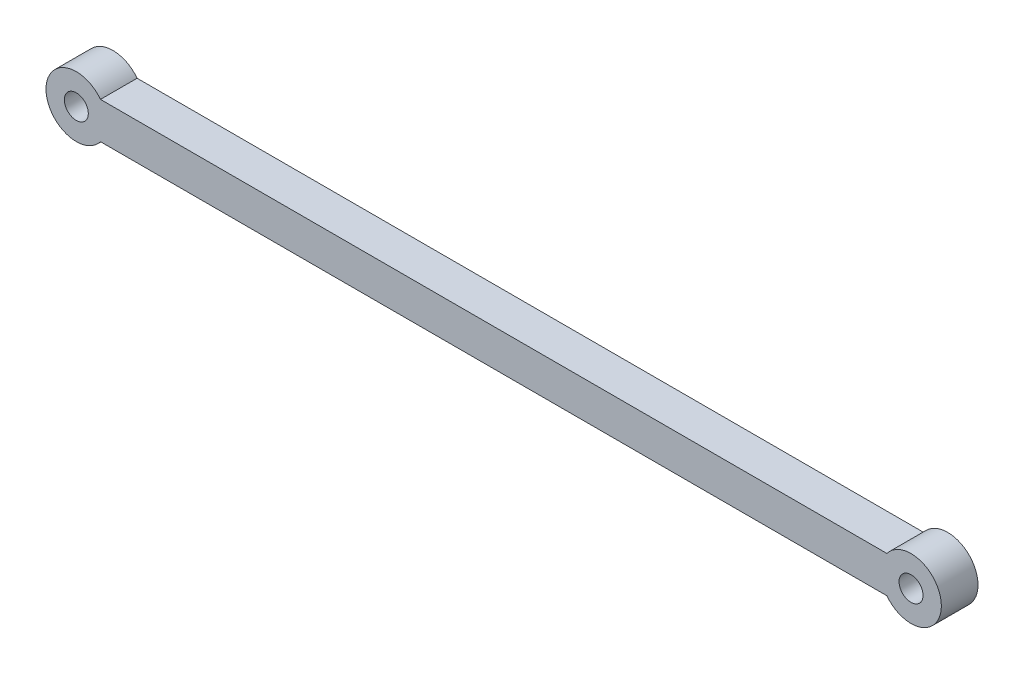
ISO-10303-21;
HEADER;
FILE_DESCRIPTION(('STEP AP214'),'2;1');
FILE_NAME('part.step','',(''),(''),'','','');
FILE_SCHEMA(('AUTOMOTIVE_DESIGN { 1 0 10303 214 1 1 1 1 }'));
ENDSEC;
DATA;
#1=APPLICATION_CONTEXT('core data for automotive mechanical design processes');
#2=APPLICATION_PROTOCOL_DEFINITION('international standard','automotive_design',2000,#1);
#3=PRODUCT_CONTEXT('',#1,'mechanical');
#4=PRODUCT('Part','Part','',(#3));
#5=PRODUCT_RELATED_PRODUCT_CATEGORY('part','',(#4));
#6=PRODUCT_DEFINITION_FORMATION('','',#4);
#7=PRODUCT_DEFINITION_CONTEXT('part definition',#1,'design');
#8=PRODUCT_DEFINITION('design','',#6,#7);
#9=PRODUCT_DEFINITION_SHAPE('','',#8);
#10=(LENGTH_UNIT() NAMED_UNIT(*) SI_UNIT(.MILLI.,.METRE.));
#11=(NAMED_UNIT(*) PLANE_ANGLE_UNIT() SI_UNIT($,.RADIAN.));
#12=(NAMED_UNIT(*) SI_UNIT($,.STERADIAN.) SOLID_ANGLE_UNIT());
#13=UNCERTAINTY_MEASURE_WITH_UNIT(LENGTH_MEASURE(1.E-05),#10,'distance_accuracy_value','');
#14=(GEOMETRIC_REPRESENTATION_CONTEXT(3) GLOBAL_UNCERTAINTY_ASSIGNED_CONTEXT((#13)) GLOBAL_UNIT_ASSIGNED_CONTEXT((#10,
#11,#12)) REPRESENTATION_CONTEXT('',''));
#15=CARTESIAN_POINT('',(0.,0.,0.));
#16=DIRECTION('',(0.,0.,1.));
#17=DIRECTION('',(1.,0.,0.));
#18=AXIS2_PLACEMENT_3D('',#15,#16,#17);
#19=CARTESIAN_POINT('',(-610.888476575822,10.97625,10.97625));
#20=DIRECTION('',(0.,1.,0.));
#21=DIRECTION('',(0.,0.,1.));
#22=AXIS2_PLACEMENT_3D('',#19,#20,#21);
#23=PLANE('',#22);
#24=DIRECTION('',(1.,0.,0.));
#25=VECTOR('',#24,1.);
#26=CARTESIAN_POINT('',(-610.888476575822,10.97625,-10.97625));
#27=LINE('',#26,#25);
#28=CARTESIAN_POINT('',(-610.888476575822,10.97625,-10.97625));
#29=VERTEX_POINT('',#28);
#30=CARTESIAN_POINT('',(-139.815748776291,10.97625,-10.97625));
#31=VERTEX_POINT('',#30);
#32=EDGE_CURVE('E141',#29,#31,#27,.T.);
#33=ORIENTED_EDGE('',*,*,#32,.F.);
#34=DIRECTION('',(0.,0.,-1.));
#35=VECTOR('',#34,1.);
#36=CARTESIAN_POINT('',(-610.888476575822,10.97625,10.97625));
#37=LINE('',#36,#35);
#38=CARTESIAN_POINT('',(-610.888476575822,10.97625,10.97625));
#39=VERTEX_POINT('',#38);
#40=EDGE_CURVE('E95',#39,#29,#37,.T.);
#41=ORIENTED_EDGE('',*,*,#40,.F.);
#42=DIRECTION('',(1.,0.,0.));
#43=VECTOR('',#42,1.);
#44=CARTESIAN_POINT('',(-610.888476575822,10.97625,10.97625));
#45=LINE('',#44,#43);
#46=CARTESIAN_POINT('',(-139.815748776291,10.97625,10.97625));
#47=VERTEX_POINT('',#46);
#48=EDGE_CURVE('E140',#39,#47,#45,.T.);
#49=ORIENTED_EDGE('',*,*,#48,.T.);
#50=DIRECTION('',(0.,0.,-1.));
#51=VECTOR('',#50,1.);
#52=CARTESIAN_POINT('',(-139.815748776291,10.97625,10.97625));
#53=LINE('',#52,#51);
#54=EDGE_CURVE('E108',#47,#31,#53,.T.);
#55=ORIENTED_EDGE('',*,*,#54,.T.);
#56=EDGE_LOOP('',(#33,#41,#49,#55));
#57=FACE_BOUND('',#56,.T.);
#58=ADVANCED_FACE('F75',(#57),#23,.T.);
#59=CARTESIAN_POINT('',(-610.888476575822,-10.97625,10.97625));
#60=DIRECTION('',(0.,1.,0.));
#61=DIRECTION('',(0.,0.,1.));
#62=AXIS2_PLACEMENT_3D('',#59,#60,#61);
#63=PLANE('',#62);
#64=DIRECTION('',(1.,0.,0.));
#65=VECTOR('',#64,1.);
#66=CARTESIAN_POINT('',(-610.888476575822,-10.97625,-10.97625));
#67=LINE('',#66,#65);
#68=CARTESIAN_POINT('',(-610.888476575822,-10.97625,-10.97625));
#69=VERTEX_POINT('',#68);
#70=CARTESIAN_POINT('',(-139.815748776291,-10.97625,-10.97625));
#71=VERTEX_POINT('',#70);
#72=EDGE_CURVE('E126',#69,#71,#67,.T.);
#73=ORIENTED_EDGE('',*,*,#72,.T.);
#74=DIRECTION('',(0.,0.,-1.));
#75=VECTOR('',#74,1.);
#76=CARTESIAN_POINT('',(-139.815748776291,-10.97625,10.97625));
#77=LINE('',#76,#75);
#78=CARTESIAN_POINT('',(-139.815748776291,-10.97625,10.97625));
#79=VERTEX_POINT('',#78);
#80=EDGE_CURVE('E86',#79,#71,#77,.T.);
#81=ORIENTED_EDGE('',*,*,#80,.F.);
#82=DIRECTION('',(1.,0.,0.));
#83=VECTOR('',#82,1.);
#84=CARTESIAN_POINT('',(-610.888476575822,-10.97625,10.97625));
#85=LINE('',#84,#83);
#86=CARTESIAN_POINT('',(-610.888476575822,-10.97625,10.97625));
#87=VERTEX_POINT('',#86);
#88=EDGE_CURVE('E124',#87,#79,#85,.T.);
#89=ORIENTED_EDGE('',*,*,#88,.F.);
#90=DIRECTION('',(0.,0.,-1.));
#91=VECTOR('',#90,1.);
#92=CARTESIAN_POINT('',(-610.888476575822,-10.97625,10.97625));
#93=LINE('',#92,#91);
#94=EDGE_CURVE('E12',#87,#69,#93,.T.);
#95=ORIENTED_EDGE('',*,*,#94,.T.);
#96=EDGE_LOOP('',(#73,#81,#89,#95));
#97=FACE_BOUND('',#96,.T.);
#98=ADVANCED_FACE('F122',(#97),#63,.F.);
#99=CARTESIAN_POINT('',(0.,0.,-10.97625));
#100=DIRECTION('',(0.,0.,1.));
#101=DIRECTION('',(1.,0.,0.));
#102=AXIS2_PLACEMENT_3D('',#99,#100,#101);
#103=PLANE('',#102);
#104=CARTESIAN_POINT('',(-625.352112676056,0.,-10.97625));
#105=DIRECTION('',(0.,0.,1.));
#106=DIRECTION('',(1.,0.,0.));
#107=AXIS2_PLACEMENT_3D('',#104,#105,#106);
#108=CIRCLE('',#107,7.1807);
#109=CARTESIAN_POINT('',(-618.171412676056,0.,-10.97625));
#110=VERTEX_POINT('',#109);
#111=EDGE_CURVE('E165',#110,#110,#108,.T.);
#112=ORIENTED_EDGE('',*,*,#111,.T.);
#113=EDGE_LOOP('',(#112));
#114=FACE_BOUND('',#113,.T.);
#115=CARTESIAN_POINT('',(-125.352112676056,0.,-10.97625));
#116=DIRECTION('',(0.,0.,1.));
#117=DIRECTION('',(1.,0.,0.));
#118=AXIS2_PLACEMENT_3D('',#115,#116,#117);
#119=CIRCLE('',#118,7.18069999999999);
#120=CARTESIAN_POINT('',(-118.171412676056,0.,-10.97625));
#121=VERTEX_POINT('',#120);
#122=EDGE_CURVE('E149',#121,#121,#119,.T.);
#123=ORIENTED_EDGE('',*,*,#122,.T.);
#124=EDGE_LOOP('',(#123));
#125=FACE_BOUND('',#124,.T.);
#126=ORIENTED_EDGE('',*,*,#72,.F.);
#127=CARTESIAN_POINT('',(-625.352112676056,0.,-10.97625));
#128=DIRECTION('',(0.,0.,1.));
#129=DIRECTION('',(1.,0.,0.));
#130=AXIS2_PLACEMENT_3D('',#127,#128,#129);
#131=CIRCLE('',#130,18.1569499999999);
#132=EDGE_CURVE('E136',#29,#69,#131,.T.);
#133=ORIENTED_EDGE('',*,*,#132,.F.);
#134=ORIENTED_EDGE('',*,*,#32,.T.);
#135=CARTESIAN_POINT('',(-125.352112676056,0.,-10.97625));
#136=DIRECTION('',(0.,0.,1.));
#137=DIRECTION('',(1.,0.,0.));
#138=AXIS2_PLACEMENT_3D('',#135,#136,#137);
#139=CIRCLE('',#138,18.1569499999999);
#140=EDGE_CURVE('E79',#71,#31,#139,.T.);
#141=ORIENTED_EDGE('',*,*,#140,.F.);
#142=EDGE_LOOP('',(#126,#133,#134,#141));
#143=FACE_BOUND('',#142,.T.);
#144=ADVANCED_FACE('F163',(#114,#125,#143),#103,.F.);
#145=CARTESIAN_POINT('',(0.,0.,10.97625));
#146=DIRECTION('',(0.,0.,1.));
#147=DIRECTION('',(1.,0.,0.));
#148=AXIS2_PLACEMENT_3D('',#145,#146,#147);
#149=PLANE('',#148);
#150=CARTESIAN_POINT('',(-625.352112676056,0.,10.97625));
#151=DIRECTION('',(0.,0.,1.));
#152=DIRECTION('',(1.,0.,0.));
#153=AXIS2_PLACEMENT_3D('',#150,#151,#152);
#154=CIRCLE('',#153,7.1807);
#155=CARTESIAN_POINT('',(-618.171412676056,0.,10.97625));
#156=VERTEX_POINT('',#155);
#157=EDGE_CURVE('E168',#156,#156,#154,.T.);
#158=ORIENTED_EDGE('',*,*,#157,.F.);
#159=EDGE_LOOP('',(#158));
#160=FACE_BOUND('',#159,.T.);
#161=CARTESIAN_POINT('',(-125.352112676056,0.,10.97625));
#162=DIRECTION('',(0.,0.,1.));
#163=DIRECTION('',(1.,0.,0.));
#164=AXIS2_PLACEMENT_3D('',#161,#162,#163);
#165=CIRCLE('',#164,7.18069999999999);
#166=CARTESIAN_POINT('',(-118.171412676056,0.,10.97625));
#167=VERTEX_POINT('',#166);
#168=EDGE_CURVE('E174',#167,#167,#165,.T.);
#169=ORIENTED_EDGE('',*,*,#168,.F.);
#170=EDGE_LOOP('',(#169));
#171=FACE_BOUND('',#170,.T.);
#172=ORIENTED_EDGE('',*,*,#48,.F.);
#173=CARTESIAN_POINT('',(-625.352112676056,0.,10.97625));
#174=DIRECTION('',(0.,0.,1.));
#175=DIRECTION('',(1.,0.,0.));
#176=AXIS2_PLACEMENT_3D('',#173,#174,#175);
#177=CIRCLE('',#176,18.1569499999999);
#178=EDGE_CURVE('E138',#39,#87,#177,.T.);
#179=ORIENTED_EDGE('',*,*,#178,.T.);
#180=ORIENTED_EDGE('',*,*,#88,.T.);
#181=CARTESIAN_POINT('',(-125.352112676056,0.,10.97625));
#182=DIRECTION('',(0.,0.,1.));
#183=DIRECTION('',(1.,0.,0.));
#184=AXIS2_PLACEMENT_3D('',#181,#182,#183);
#185=CIRCLE('',#184,18.1569499999999);
#186=EDGE_CURVE('E132',#79,#47,#185,.T.);
#187=ORIENTED_EDGE('',*,*,#186,.T.);
#188=EDGE_LOOP('',(#172,#179,#180,#187));
#189=FACE_BOUND('',#188,.T.);
#190=ADVANCED_FACE('F137',(#160,#171,#189),#149,.T.);
#191=CARTESIAN_POINT('',(-125.352112676056,0.,10.97625));
#192=DIRECTION('',(0.,0.,-1.));
#193=DIRECTION('',(-1.,0.,0.));
#194=AXIS2_PLACEMENT_3D('',#191,#192,#193);
#195=CYLINDRICAL_SURFACE('',#194,18.1569499999999);
#196=ORIENTED_EDGE('',*,*,#80,.T.);
#197=ORIENTED_EDGE('',*,*,#140,.T.);
#198=ORIENTED_EDGE('',*,*,#54,.F.);
#199=ORIENTED_EDGE('',*,*,#186,.F.);
#200=EDGE_LOOP('',(#196,#197,#198,#199));
#201=FACE_BOUND('',#200,.T.);
#202=ADVANCED_FACE('F77',(#201),#195,.T.);
#203=CARTESIAN_POINT('',(-625.352112676056,0.,10.97625));
#204=DIRECTION('',(0.,0.,-1.));
#205=DIRECTION('',(-1.,0.,0.));
#206=AXIS2_PLACEMENT_3D('',#203,#204,#205);
#207=CYLINDRICAL_SURFACE('',#206,18.1569499999999);
#208=ORIENTED_EDGE('',*,*,#132,.T.);
#209=ORIENTED_EDGE('',*,*,#94,.F.);
#210=ORIENTED_EDGE('',*,*,#178,.F.);
#211=ORIENTED_EDGE('',*,*,#40,.T.);
#212=EDGE_LOOP('',(#208,#209,#210,#211));
#213=FACE_BOUND('',#212,.T.);
#214=ADVANCED_FACE('F161',(#213),#207,.T.);
#215=CARTESIAN_POINT('',(-125.352112676056,0.,-10.97625));
#216=DIRECTION('',(0.,0.,1.));
#217=DIRECTION('',(1.,0.,0.));
#218=AXIS2_PLACEMENT_3D('',#215,#216,#217);
#219=CYLINDRICAL_SURFACE('',#218,7.18069999999999);
#220=CARTESIAN_POINT('',(-118.171412676056,0.,-10.97625));
#221=CARTESIAN_POINT('',(-118.171412676056,0.,-10.747578125));
#222=CARTESIAN_POINT('',(-118.171412676056,0.,-10.51890625));
#223=CARTESIAN_POINT('',(-118.171412676056,0.,-10.0615625));
#224=CARTESIAN_POINT('',(-118.171412676056,0.,-9.832890625));
#225=CARTESIAN_POINT('',(-118.171412676056,0.,-9.375546875));
#226=CARTESIAN_POINT('',(-118.171412676056,0.,-9.146875));
#227=CARTESIAN_POINT('',(-118.171412676056,0.,-8.68953125));
#228=CARTESIAN_POINT('',(-118.171412676056,0.,-8.460859375));
#229=CARTESIAN_POINT('',(-118.171412676056,0.,-8.003515625));
#230=CARTESIAN_POINT('',(-118.171412676056,0.,-7.77484375));
#231=CARTESIAN_POINT('',(-118.171412676056,0.,-7.3175));
#232=CARTESIAN_POINT('',(-118.171412676056,0.,-7.088828125));
#233=CARTESIAN_POINT('',(-118.171412676056,0.,-6.631484375));
#234=CARTESIAN_POINT('',(-118.171412676056,0.,-6.4028125));
#235=CARTESIAN_POINT('',(-118.171412676056,0.,-5.94546875));
#236=CARTESIAN_POINT('',(-118.171412676056,0.,-5.716796875));
#237=CARTESIAN_POINT('',(-118.171412676056,0.,-5.259453125));
#238=CARTESIAN_POINT('',(-118.171412676056,0.,-5.03078125));
#239=CARTESIAN_POINT('',(-118.171412676056,0.,-4.5734375));
#240=CARTESIAN_POINT('',(-118.171412676056,0.,-4.344765625));
#241=CARTESIAN_POINT('',(-118.171412676056,0.,-3.887421875));
#242=CARTESIAN_POINT('',(-118.171412676056,0.,-3.65875));
#243=CARTESIAN_POINT('',(-118.171412676056,0.,-3.20140625));
#244=CARTESIAN_POINT('',(-118.171412676056,0.,-2.972734375));
#245=CARTESIAN_POINT('',(-118.171412676056,0.,-2.515390625));
#246=CARTESIAN_POINT('',(-118.171412676056,0.,-2.28671875));
#247=CARTESIAN_POINT('',(-118.171412676056,0.,-1.829375));
#248=CARTESIAN_POINT('',(-118.171412676056,0.,-1.600703125));
#249=CARTESIAN_POINT('',(-118.171412676056,0.,-1.143359375));
#250=CARTESIAN_POINT('',(-118.171412676056,0.,-0.914687500000001));
#251=CARTESIAN_POINT('',(-118.171412676056,0.,-0.457343750000001));
#252=CARTESIAN_POINT('',(-118.171412676056,0.,-0.228671875000002));
#253=CARTESIAN_POINT('',(-118.171412676056,0.,0.228671874999998));
#254=CARTESIAN_POINT('',(-118.171412676056,0.,0.457343749999998));
#255=CARTESIAN_POINT('',(-118.171412676056,0.,0.914687499999998));
#256=CARTESIAN_POINT('',(-118.171412676056,0.,1.143359375));
#257=CARTESIAN_POINT('',(-118.171412676056,0.,1.600703125));
#258=CARTESIAN_POINT('',(-118.171412676056,0.,1.829375));
#259=CARTESIAN_POINT('',(-118.171412676056,0.,2.28671875));
#260=CARTESIAN_POINT('',(-118.171412676056,0.,2.515390625));
#261=CARTESIAN_POINT('',(-118.171412676056,0.,2.972734375));
#262=CARTESIAN_POINT('',(-118.171412676056,0.,3.20140625));
#263=CARTESIAN_POINT('',(-118.171412676056,0.,3.65875));
#264=CARTESIAN_POINT('',(-118.171412676056,0.,3.887421875));
#265=CARTESIAN_POINT('',(-118.171412676056,0.,4.344765625));
#266=CARTESIAN_POINT('',(-118.171412676056,0.,4.5734375));
#267=CARTESIAN_POINT('',(-118.171412676056,0.,5.03078125));
#268=CARTESIAN_POINT('',(-118.171412676056,0.,5.259453125));
#269=CARTESIAN_POINT('',(-118.171412676056,0.,5.716796875));
#270=CARTESIAN_POINT('',(-118.171412676056,0.,5.94546875));
#271=CARTESIAN_POINT('',(-118.171412676056,0.,6.4028125));
#272=CARTESIAN_POINT('',(-118.171412676056,0.,6.631484375));
#273=CARTESIAN_POINT('',(-118.171412676056,0.,7.088828125));
#274=CARTESIAN_POINT('',(-118.171412676056,0.,7.3175));
#275=CARTESIAN_POINT('',(-118.171412676056,0.,7.77484375));
#276=CARTESIAN_POINT('',(-118.171412676056,0.,8.003515625));
#277=CARTESIAN_POINT('',(-118.171412676056,0.,8.460859375));
#278=CARTESIAN_POINT('',(-118.171412676056,0.,8.68953125));
#279=CARTESIAN_POINT('',(-118.171412676056,0.,9.146875));
#280=CARTESIAN_POINT('',(-118.171412676056,0.,9.375546875));
#281=CARTESIAN_POINT('',(-118.171412676056,0.,9.832890625));
#282=CARTESIAN_POINT('',(-118.171412676056,0.,10.0615625));
#283=CARTESIAN_POINT('',(-118.171412676056,0.,10.51890625));
#284=CARTESIAN_POINT('',(-118.171412676056,0.,10.747578125));
#285=CARTESIAN_POINT('',(-118.171412676056,0.,10.97625));
#286=B_SPLINE_CURVE_WITH_KNOTS('',3,(#220,#221,#222,#223,#224,#225,#226,#227,#228,#229,#230,
#231,#232,#233,#234,#235,#236,#237,#238,#239,#240,#241,#242,#243,#244,#245,#246,#247,#248,#249,
#250,#251,#252,#253,#254,#255,#256,#257,#258,#259,#260,#261,#262,#263,#264,#265,#266,#267,#268,
#269,#270,#271,#272,#273,#274,#275,#276,#277,#278,#279,#280,#281,#282,#283,#284,#285),
.UNSPECIFIED.,.F.,.F.,(4,2,2,2,2,2,2,2,2,2,2,2,2,2,2,2,2,2,2,2,2,2,2,2,2,2,2,2,2,2,2,2,4),(0.,
0.686015625,1.37203125,2.058046875,2.7440625,3.430078125,4.11609375,4.802109375,5.488125,
6.174140625,6.86015625,7.546171875,8.2321875,8.918203125,9.60421875,10.290234375,10.97625,
11.662265625,12.34828125,13.034296875,13.7203125,14.406328125,15.09234375,15.778359375,
16.464375,17.150390625,17.83640625,18.522421875,19.2084375,19.894453125,20.58046875,
21.266484375,21.9525),.UNSPECIFIED.);
#287=EDGE_CURVE('BSEAM185',#121,#167,#286,.T.);
#288=ORIENTED_EDGE('',*,*,#122,.F.);
#289=ORIENTED_EDGE('',*,*,#168,.T.);
#290=ORIENTED_EDGE('',*,*,#287,.T.);
#291=ORIENTED_EDGE('',*,*,#287,.F.);
#292=EDGE_LOOP('',(#288,#290,#289,#291));
#293=FACE_BOUND('',#292,.T.);
#294=ADVANCED_FACE('F185',(#293),#219,.F.);
#295=CARTESIAN_POINT('',(-625.352112676056,0.,-10.97625));
#296=DIRECTION('',(0.,0.,1.));
#297=DIRECTION('',(1.,0.,0.));
#298=AXIS2_PLACEMENT_3D('',#295,#296,#297);
#299=CYLINDRICAL_SURFACE('',#298,7.1807);
#300=CARTESIAN_POINT('',(-618.171412676056,0.,-10.97625));
#301=CARTESIAN_POINT('',(-618.171412676056,0.,-10.747578125));
#302=CARTESIAN_POINT('',(-618.171412676056,0.,-10.51890625));
#303=CARTESIAN_POINT('',(-618.171412676056,0.,-10.0615625));
#304=CARTESIAN_POINT('',(-618.171412676056,0.,-9.832890625));
#305=CARTESIAN_POINT('',(-618.171412676056,0.,-9.375546875));
#306=CARTESIAN_POINT('',(-618.171412676056,0.,-9.146875));
#307=CARTESIAN_POINT('',(-618.171412676056,0.,-8.68953125));
#308=CARTESIAN_POINT('',(-618.171412676056,0.,-8.460859375));
#309=CARTESIAN_POINT('',(-618.171412676056,0.,-8.003515625));
#310=CARTESIAN_POINT('',(-618.171412676056,0.,-7.77484375));
#311=CARTESIAN_POINT('',(-618.171412676056,0.,-7.3175));
#312=CARTESIAN_POINT('',(-618.171412676056,0.,-7.088828125));
#313=CARTESIAN_POINT('',(-618.171412676056,0.,-6.631484375));
#314=CARTESIAN_POINT('',(-618.171412676056,0.,-6.4028125));
#315=CARTESIAN_POINT('',(-618.171412676056,0.,-5.94546875));
#316=CARTESIAN_POINT('',(-618.171412676056,0.,-5.716796875));
#317=CARTESIAN_POINT('',(-618.171412676056,0.,-5.259453125));
#318=CARTESIAN_POINT('',(-618.171412676056,0.,-5.03078125));
#319=CARTESIAN_POINT('',(-618.171412676056,0.,-4.5734375));
#320=CARTESIAN_POINT('',(-618.171412676056,0.,-4.344765625));
#321=CARTESIAN_POINT('',(-618.171412676056,0.,-3.887421875));
#322=CARTESIAN_POINT('',(-618.171412676056,0.,-3.65875));
#323=CARTESIAN_POINT('',(-618.171412676056,0.,-3.20140625));
#324=CARTESIAN_POINT('',(-618.171412676056,0.,-2.972734375));
#325=CARTESIAN_POINT('',(-618.171412676056,0.,-2.515390625));
#326=CARTESIAN_POINT('',(-618.171412676056,0.,-2.28671875));
#327=CARTESIAN_POINT('',(-618.171412676056,0.,-1.829375));
#328=CARTESIAN_POINT('',(-618.171412676056,0.,-1.600703125));
#329=CARTESIAN_POINT('',(-618.171412676056,0.,-1.143359375));
#330=CARTESIAN_POINT('',(-618.171412676056,0.,-0.914687500000001));
#331=CARTESIAN_POINT('',(-618.171412676056,0.,-0.457343750000001));
#332=CARTESIAN_POINT('',(-618.171412676056,0.,-0.228671875000002));
#333=CARTESIAN_POINT('',(-618.171412676056,0.,0.228671874999998));
#334=CARTESIAN_POINT('',(-618.171412676056,0.,0.457343749999998));
#335=CARTESIAN_POINT('',(-618.171412676056,0.,0.914687499999998));
#336=CARTESIAN_POINT('',(-618.171412676056,0.,1.143359375));
#337=CARTESIAN_POINT('',(-618.171412676056,0.,1.600703125));
#338=CARTESIAN_POINT('',(-618.171412676056,0.,1.829375));
#339=CARTESIAN_POINT('',(-618.171412676056,0.,2.28671875));
#340=CARTESIAN_POINT('',(-618.171412676056,0.,2.515390625));
#341=CARTESIAN_POINT('',(-618.171412676056,0.,2.972734375));
#342=CARTESIAN_POINT('',(-618.171412676056,0.,3.20140625));
#343=CARTESIAN_POINT('',(-618.171412676056,0.,3.65875));
#344=CARTESIAN_POINT('',(-618.171412676056,0.,3.887421875));
#345=CARTESIAN_POINT('',(-618.171412676056,0.,4.344765625));
#346=CARTESIAN_POINT('',(-618.171412676056,0.,4.5734375));
#347=CARTESIAN_POINT('',(-618.171412676056,0.,5.03078125));
#348=CARTESIAN_POINT('',(-618.171412676056,0.,5.259453125));
#349=CARTESIAN_POINT('',(-618.171412676056,0.,5.716796875));
#350=CARTESIAN_POINT('',(-618.171412676056,0.,5.94546875));
#351=CARTESIAN_POINT('',(-618.171412676056,0.,6.4028125));
#352=CARTESIAN_POINT('',(-618.171412676056,0.,6.631484375));
#353=CARTESIAN_POINT('',(-618.171412676056,0.,7.088828125));
#354=CARTESIAN_POINT('',(-618.171412676056,0.,7.3175));
#355=CARTESIAN_POINT('',(-618.171412676056,0.,7.77484375));
#356=CARTESIAN_POINT('',(-618.171412676056,0.,8.003515625));
#357=CARTESIAN_POINT('',(-618.171412676056,0.,8.460859375));
#358=CARTESIAN_POINT('',(-618.171412676056,0.,8.68953125));
#359=CARTESIAN_POINT('',(-618.171412676056,0.,9.146875));
#360=CARTESIAN_POINT('',(-618.171412676056,0.,9.375546875));
#361=CARTESIAN_POINT('',(-618.171412676056,0.,9.832890625));
#362=CARTESIAN_POINT('',(-618.171412676056,0.,10.0615625));
#363=CARTESIAN_POINT('',(-618.171412676056,0.,10.51890625));
#364=CARTESIAN_POINT('',(-618.171412676056,0.,10.747578125));
#365=CARTESIAN_POINT('',(-618.171412676056,0.,10.97625));
#366=B_SPLINE_CURVE_WITH_KNOTS('',3,(#300,#301,#302,#303,#304,#305,#306,#307,#308,#309,#310,
#311,#312,#313,#314,#315,#316,#317,#318,#319,#320,#321,#322,#323,#324,#325,#326,#327,#328,#329,
#330,#331,#332,#333,#334,#335,#336,#337,#338,#339,#340,#341,#342,#343,#344,#345,#346,#347,#348,
#349,#350,#351,#352,#353,#354,#355,#356,#357,#358,#359,#360,#361,#362,#363,#364,#365),
.UNSPECIFIED.,.F.,.F.,(4,2,2,2,2,2,2,2,2,2,2,2,2,2,2,2,2,2,2,2,2,2,2,2,2,2,2,2,2,2,2,2,4),(0.,
0.686015625,1.37203125,2.058046875,2.7440625,3.430078125,4.11609375,4.802109375,5.488125,
6.174140625,6.86015625,7.546171875,8.2321875,8.918203125,9.60421875,10.290234375,10.97625,
11.662265625,12.34828125,13.034296875,13.7203125,14.406328125,15.09234375,15.778359375,
16.464375,17.150390625,17.83640625,18.522421875,19.2084375,19.894453125,20.58046875,
21.266484375,21.9525),.UNSPECIFIED.);
#367=EDGE_CURVE('BSEAM187',#110,#156,#366,.T.);
#368=ORIENTED_EDGE('',*,*,#111,.F.);
#369=ORIENTED_EDGE('',*,*,#157,.T.);
#370=ORIENTED_EDGE('',*,*,#367,.T.);
#371=ORIENTED_EDGE('',*,*,#367,.F.);
#372=EDGE_LOOP('',(#368,#370,#369,#371));
#373=FACE_BOUND('',#372,.T.);
#374=ADVANCED_FACE('F187',(#373),#299,.F.);
#375=CLOSED_SHELL('',(#58,#98,#144,#190,#202,#214,#294,#374));
#376=MANIFOLD_SOLID_BREP('B2',#375);
#377=ADVANCED_BREP_SHAPE_REPRESENTATION('',(#18,#376),#14);
#378=SHAPE_DEFINITION_REPRESENTATION(#9,#377);
ENDSEC;
END-ISO-10303-21;
